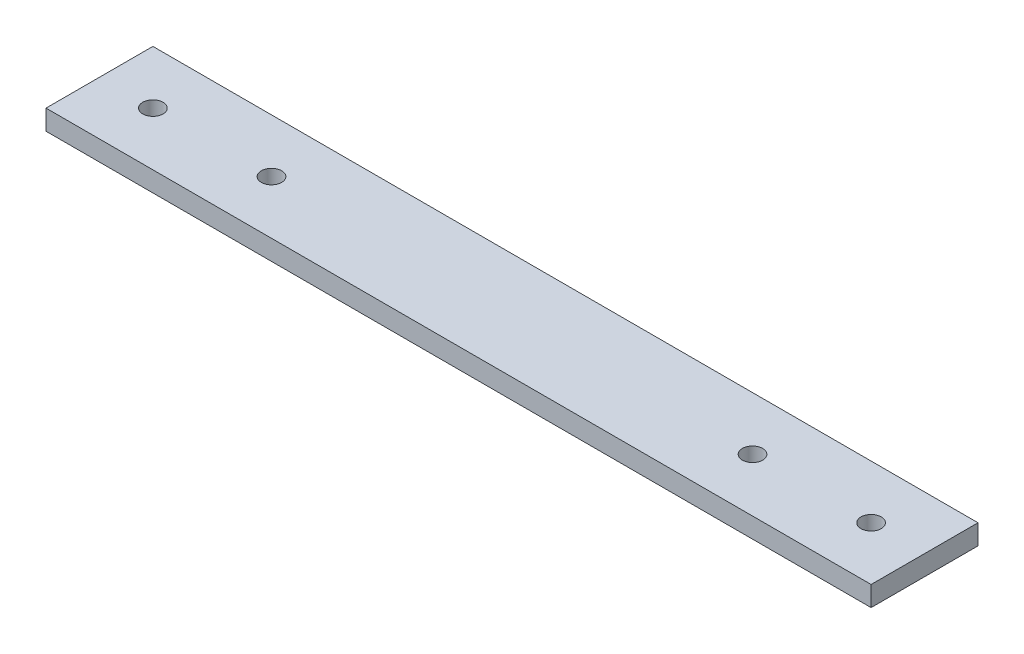
ISO-10303-21;
HEADER;
FILE_DESCRIPTION(('STEP AP214'),'2;1');
FILE_NAME('part.step','',(''),(''),'','','');
FILE_SCHEMA(('AUTOMOTIVE_DESIGN { 1 0 10303 214 1 1 1 1 }'));
ENDSEC;
DATA;
#1=APPLICATION_CONTEXT('core data for automotive mechanical design processes');
#2=APPLICATION_PROTOCOL_DEFINITION('international standard','automotive_design',2000,#1);
#3=PRODUCT_CONTEXT('',#1,'mechanical');
#4=PRODUCT('Part','Part','',(#3));
#5=PRODUCT_RELATED_PRODUCT_CATEGORY('part','',(#4));
#6=PRODUCT_DEFINITION_FORMATION('','',#4);
#7=PRODUCT_DEFINITION_CONTEXT('part definition',#1,'design');
#8=PRODUCT_DEFINITION('design','',#6,#7);
#9=PRODUCT_DEFINITION_SHAPE('','',#8);
#10=(LENGTH_UNIT() NAMED_UNIT(*) SI_UNIT(.MILLI.,.METRE.));
#11=(NAMED_UNIT(*) PLANE_ANGLE_UNIT() SI_UNIT($,.RADIAN.));
#12=(NAMED_UNIT(*) SI_UNIT($,.STERADIAN.) SOLID_ANGLE_UNIT());
#13=UNCERTAINTY_MEASURE_WITH_UNIT(LENGTH_MEASURE(1.E-05),#10,'distance_accuracy_value','');
#14=(GEOMETRIC_REPRESENTATION_CONTEXT(3) GLOBAL_UNCERTAINTY_ASSIGNED_CONTEXT((#13)) GLOBAL_UNIT_ASSIGNED_CONTEXT((#10,
#11,#12)) REPRESENTATION_CONTEXT('',''));
#15=CARTESIAN_POINT('',(0.,0.,0.));
#16=DIRECTION('',(0.,0.,1.));
#17=DIRECTION('',(1.,0.,0.));
#18=AXIS2_PLACEMENT_3D('',#15,#16,#17);
#19=CARTESIAN_POINT('',(-98.0313,4.7625,12.7));
#20=DIRECTION('',(1.,0.,0.));
#21=DIRECTION('',(0.,0.,-1.));
#22=AXIS2_PLACEMENT_3D('',#19,#20,#21);
#23=PLANE('',#22);
#24=DIRECTION('',(0.,0.,1.));
#25=VECTOR('',#24,1.);
#26=CARTESIAN_POINT('',(-98.0313,0.,12.7));
#27=LINE('',#26,#25);
#28=CARTESIAN_POINT('',(-98.0313,0.,-12.7));
#29=VERTEX_POINT('',#28);
#30=CARTESIAN_POINT('',(-98.0313,0.,12.7));
#31=VERTEX_POINT('',#30);
#32=EDGE_CURVE('E97',#29,#31,#27,.T.);
#33=ORIENTED_EDGE('',*,*,#32,.T.);
#34=DIRECTION('',(0.,-1.,0.));
#35=VECTOR('',#34,1.);
#36=CARTESIAN_POINT('',(-98.0313,4.7625,12.7));
#37=LINE('',#36,#35);
#38=CARTESIAN_POINT('',(-98.0313,4.7625,12.7));
#39=VERTEX_POINT('',#38);
#40=EDGE_CURVE('E11',#39,#31,#37,.T.);
#41=ORIENTED_EDGE('',*,*,#40,.F.);
#42=DIRECTION('',(0.,0.,1.));
#43=VECTOR('',#42,1.);
#44=CARTESIAN_POINT('',(-98.0313,4.7625,12.7));
#45=LINE('',#44,#43);
#46=CARTESIAN_POINT('',(-98.0313,4.7625,-12.7));
#47=VERTEX_POINT('',#46);
#48=EDGE_CURVE('E85',#47,#39,#45,.T.);
#49=ORIENTED_EDGE('',*,*,#48,.F.);
#50=DIRECTION('',(0.,-1.,0.));
#51=VECTOR('',#50,1.);
#52=CARTESIAN_POINT('',(-98.0313,4.7625,-12.7));
#53=LINE('',#52,#51);
#54=EDGE_CURVE('E93',#47,#29,#53,.T.);
#55=ORIENTED_EDGE('',*,*,#54,.T.);
#56=EDGE_LOOP('',(#33,#41,#49,#55));
#57=FACE_BOUND('',#56,.T.);
#58=ADVANCED_FACE('F34',(#57),#23,.F.);
#59=CARTESIAN_POINT('',(98.0313,4.7625,12.7));
#60=DIRECTION('',(0.,0.,-1.));
#61=DIRECTION('',(-1.,0.,0.));
#62=AXIS2_PLACEMENT_3D('',#59,#60,#61);
#63=PLANE('',#62);
#64=DIRECTION('',(1.,0.,0.));
#65=VECTOR('',#64,1.);
#66=CARTESIAN_POINT('',(98.0313,0.,12.7));
#67=LINE('',#66,#65);
#68=CARTESIAN_POINT('',(98.0313,0.,12.7));
#69=VERTEX_POINT('',#68);
#70=EDGE_CURVE('E89',#31,#69,#67,.T.);
#71=ORIENTED_EDGE('',*,*,#70,.T.);
#72=DIRECTION('',(0.,-1.,0.));
#73=VECTOR('',#72,1.);
#74=CARTESIAN_POINT('',(98.0313,4.7625,12.7));
#75=LINE('',#74,#73);
#76=CARTESIAN_POINT('',(98.0313,4.7625,12.7));
#77=VERTEX_POINT('',#76);
#78=EDGE_CURVE('E42',#77,#69,#75,.T.);
#79=ORIENTED_EDGE('',*,*,#78,.F.);
#80=DIRECTION('',(1.,0.,0.));
#81=VECTOR('',#80,1.);
#82=CARTESIAN_POINT('',(98.0313,4.7625,12.7));
#83=LINE('',#82,#81);
#84=EDGE_CURVE('E80',#39,#77,#83,.T.);
#85=ORIENTED_EDGE('',*,*,#84,.F.);
#86=ORIENTED_EDGE('',*,*,#40,.T.);
#87=EDGE_LOOP('',(#71,#79,#85,#86));
#88=FACE_BOUND('',#87,.T.);
#89=ADVANCED_FACE('F88',(#88),#63,.F.);
#90=CARTESIAN_POINT('',(98.0313,4.7625,12.7));
#91=DIRECTION('',(-1.,0.,0.));
#92=DIRECTION('',(0.,0.,1.));
#93=AXIS2_PLACEMENT_3D('',#90,#91,#92);
#94=PLANE('',#93);
#95=DIRECTION('',(0.,0.,-1.));
#96=VECTOR('',#95,1.);
#97=CARTESIAN_POINT('',(98.0313,0.,12.7));
#98=LINE('',#97,#96);
#99=CARTESIAN_POINT('',(98.0313,0.,-12.7));
#100=VERTEX_POINT('',#99);
#101=EDGE_CURVE('E67',#69,#100,#98,.T.);
#102=ORIENTED_EDGE('',*,*,#101,.T.);
#103=DIRECTION('',(0.,-1.,0.));
#104=VECTOR('',#103,1.);
#105=CARTESIAN_POINT('',(98.0313,4.7625,-12.7));
#106=LINE('',#105,#104);
#107=CARTESIAN_POINT('',(98.0313,4.7625,-12.7));
#108=VERTEX_POINT('',#107);
#109=EDGE_CURVE('E90',#108,#100,#106,.T.);
#110=ORIENTED_EDGE('',*,*,#109,.F.);
#111=DIRECTION('',(0.,0.,-1.));
#112=VECTOR('',#111,1.);
#113=CARTESIAN_POINT('',(98.0313,4.7625,12.7));
#114=LINE('',#113,#112);
#115=EDGE_CURVE('E83',#77,#108,#114,.T.);
#116=ORIENTED_EDGE('',*,*,#115,.F.);
#117=ORIENTED_EDGE('',*,*,#78,.T.);
#118=EDGE_LOOP('',(#102,#110,#116,#117));
#119=FACE_BOUND('',#118,.T.);
#120=ADVANCED_FACE('F91',(#119),#94,.F.);
#121=CARTESIAN_POINT('',(98.0313,4.7625,-12.7));
#122=DIRECTION('',(0.,0.,1.));
#123=DIRECTION('',(1.,0.,0.));
#124=AXIS2_PLACEMENT_3D('',#121,#122,#123);
#125=PLANE('',#124);
#126=DIRECTION('',(-1.,0.,0.));
#127=VECTOR('',#126,1.);
#128=CARTESIAN_POINT('',(98.0313,0.,-12.7));
#129=LINE('',#128,#127);
#130=EDGE_CURVE('E73',#100,#29,#129,.T.);
#131=ORIENTED_EDGE('',*,*,#130,.T.);
#132=ORIENTED_EDGE('',*,*,#54,.F.);
#133=DIRECTION('',(-1.,0.,0.));
#134=VECTOR('',#133,1.);
#135=CARTESIAN_POINT('',(98.0313,4.7625,-12.7));
#136=LINE('',#135,#134);
#137=EDGE_CURVE('E50',#108,#47,#136,.T.);
#138=ORIENTED_EDGE('',*,*,#137,.F.);
#139=ORIENTED_EDGE('',*,*,#109,.T.);
#140=EDGE_LOOP('',(#131,#132,#138,#139));
#141=FACE_BOUND('',#140,.T.);
#142=ADVANCED_FACE('F105',(#141),#125,.F.);
#143=CARTESIAN_POINT('',(0.,4.7625,0.));
#144=DIRECTION('',(0.,1.,0.));
#145=DIRECTION('',(0.,0.,1.));
#146=AXIS2_PLACEMENT_3D('',#143,#144,#145);
#147=PLANE('',#146);
#148=CARTESIAN_POINT('',(85.3313,4.7625,0.));
#149=DIRECTION('',(0.,1.,0.));
#150=DIRECTION('',(0.,0.,1.));
#151=AXIS2_PLACEMENT_3D('',#148,#149,#150);
#152=CIRCLE('',#151,2.413);
#153=CARTESIAN_POINT('',(85.3313,4.7625,2.41299999999998));
#154=VERTEX_POINT('',#153);
#155=EDGE_CURVE('E117',#154,#154,#152,.T.);
#156=ORIENTED_EDGE('',*,*,#155,.F.);
#157=EDGE_LOOP('',(#156));
#158=FACE_BOUND('',#157,.T.);
#159=CARTESIAN_POINT('',(-85.3313,4.7625,0.));
#160=DIRECTION('',(0.,1.,0.));
#161=DIRECTION('',(0.,0.,1.));
#162=AXIS2_PLACEMENT_3D('',#159,#160,#161);
#163=CIRCLE('',#162,2.413);
#164=CARTESIAN_POINT('',(-85.3313,4.7625,2.413));
#165=VERTEX_POINT('',#164);
#166=EDGE_CURVE('E123',#165,#165,#163,.T.);
#167=ORIENTED_EDGE('',*,*,#166,.F.);
#168=EDGE_LOOP('',(#167));
#169=FACE_BOUND('',#168,.T.);
#170=CARTESIAN_POINT('',(57.15,4.7625,0.));
#171=DIRECTION('',(0.,1.,0.));
#172=DIRECTION('',(0.,0.,1.));
#173=AXIS2_PLACEMENT_3D('',#170,#171,#172);
#174=CIRCLE('',#173,2.413);
#175=CARTESIAN_POINT('',(57.15,4.7625,2.413));
#176=VERTEX_POINT('',#175);
#177=EDGE_CURVE('E129',#176,#176,#174,.T.);
#178=ORIENTED_EDGE('',*,*,#177,.F.);
#179=EDGE_LOOP('',(#178));
#180=FACE_BOUND('',#179,.T.);
#181=CARTESIAN_POINT('',(-57.15,4.7625,0.));
#182=DIRECTION('',(0.,1.,0.));
#183=DIRECTION('',(0.,0.,1.));
#184=AXIS2_PLACEMENT_3D('',#181,#182,#183);
#185=CIRCLE('',#184,2.413);
#186=CARTESIAN_POINT('',(-57.15,4.7625,2.413));
#187=VERTEX_POINT('',#186);
#188=EDGE_CURVE('E111',#187,#187,#185,.T.);
#189=ORIENTED_EDGE('',*,*,#188,.F.);
#190=EDGE_LOOP('',(#189));
#191=FACE_BOUND('',#190,.T.);
#192=ORIENTED_EDGE('',*,*,#48,.T.);
#193=ORIENTED_EDGE('',*,*,#84,.T.);
#194=ORIENTED_EDGE('',*,*,#115,.T.);
#195=ORIENTED_EDGE('',*,*,#137,.T.);
#196=EDGE_LOOP('',(#192,#193,#194,#195));
#197=FACE_BOUND('',#196,.T.);
#198=ADVANCED_FACE('F81',(#158,#169,#180,#191,#197),#147,.T.);
#199=CARTESIAN_POINT('',(0.,0.,0.));
#200=DIRECTION('',(0.,1.,0.));
#201=DIRECTION('',(0.,0.,1.));
#202=AXIS2_PLACEMENT_3D('',#199,#200,#201);
#203=PLANE('',#202);
#204=CARTESIAN_POINT('',(85.3313,0.,0.));
#205=DIRECTION('',(0.,1.,0.));
#206=DIRECTION('',(0.,0.,1.));
#207=AXIS2_PLACEMENT_3D('',#204,#205,#206);
#208=CIRCLE('',#207,2.413);
#209=CARTESIAN_POINT('',(85.3313,0.,2.41299999999998));
#210=VERTEX_POINT('',#209);
#211=EDGE_CURVE('E120',#210,#210,#208,.T.);
#212=ORIENTED_EDGE('',*,*,#211,.T.);
#213=EDGE_LOOP('',(#212));
#214=FACE_BOUND('',#213,.T.);
#215=CARTESIAN_POINT('',(-85.3313,0.,0.));
#216=DIRECTION('',(0.,1.,0.));
#217=DIRECTION('',(0.,0.,1.));
#218=AXIS2_PLACEMENT_3D('',#215,#216,#217);
#219=CIRCLE('',#218,2.413);
#220=CARTESIAN_POINT('',(-85.3313,0.,2.413));
#221=VERTEX_POINT('',#220);
#222=EDGE_CURVE('E126',#221,#221,#219,.T.);
#223=ORIENTED_EDGE('',*,*,#222,.T.);
#224=EDGE_LOOP('',(#223));
#225=FACE_BOUND('',#224,.T.);
#226=CARTESIAN_POINT('',(57.15,0.,0.));
#227=DIRECTION('',(0.,1.,0.));
#228=DIRECTION('',(0.,0.,1.));
#229=AXIS2_PLACEMENT_3D('',#226,#227,#228);
#230=CIRCLE('',#229,2.413);
#231=CARTESIAN_POINT('',(57.15,0.,2.413));
#232=VERTEX_POINT('',#231);
#233=EDGE_CURVE('E114',#232,#232,#230,.T.);
#234=ORIENTED_EDGE('',*,*,#233,.T.);
#235=EDGE_LOOP('',(#234));
#236=FACE_BOUND('',#235,.T.);
#237=CARTESIAN_POINT('',(-57.15,0.,0.));
#238=DIRECTION('',(0.,1.,0.));
#239=DIRECTION('',(0.,0.,1.));
#240=AXIS2_PLACEMENT_3D('',#237,#238,#239);
#241=CIRCLE('',#240,2.413);
#242=CARTESIAN_POINT('',(-57.15,0.,2.413));
#243=VERTEX_POINT('',#242);
#244=EDGE_CURVE('E100',#243,#243,#241,.T.);
#245=ORIENTED_EDGE('',*,*,#244,.T.);
#246=EDGE_LOOP('',(#245));
#247=FACE_BOUND('',#246,.T.);
#248=ORIENTED_EDGE('',*,*,#32,.F.);
#249=ORIENTED_EDGE('',*,*,#130,.F.);
#250=ORIENTED_EDGE('',*,*,#101,.F.);
#251=ORIENTED_EDGE('',*,*,#70,.F.);
#252=EDGE_LOOP('',(#248,#249,#250,#251));
#253=FACE_BOUND('',#252,.T.);
#254=ADVANCED_FACE('F108',(#214,#225,#236,#247,#253),#203,.F.);
#255=CARTESIAN_POINT('',(-57.15,0.,0.));
#256=DIRECTION('',(0.,1.,0.));
#257=DIRECTION('',(0.,0.,1.));
#258=AXIS2_PLACEMENT_3D('',#255,#256,#257);
#259=CYLINDRICAL_SURFACE('',#258,2.413);
#260=CARTESIAN_POINT('',(-57.15,0.,2.413));
#261=CARTESIAN_POINT('',(-57.15,0.049609375,2.413));
#262=CARTESIAN_POINT('',(-57.15,0.09921875,2.413));
#263=CARTESIAN_POINT('',(-57.15,0.1984375,2.413));
#264=CARTESIAN_POINT('',(-57.15,0.248046875,2.413));
#265=CARTESIAN_POINT('',(-57.15,0.347265625,2.413));
#266=CARTESIAN_POINT('',(-57.15,0.396875,2.413));
#267=CARTESIAN_POINT('',(-57.15,0.49609375,2.413));
#268=CARTESIAN_POINT('',(-57.15,0.545703125,2.413));
#269=CARTESIAN_POINT('',(-57.15,0.644921875,2.413));
#270=CARTESIAN_POINT('',(-57.15,0.69453125,2.413));
#271=CARTESIAN_POINT('',(-57.15,0.79375,2.413));
#272=CARTESIAN_POINT('',(-57.15,0.843359375,2.413));
#273=CARTESIAN_POINT('',(-57.15,0.942578125,2.413));
#274=CARTESIAN_POINT('',(-57.15,0.9921875,2.413));
#275=CARTESIAN_POINT('',(-57.15,1.09140625,2.413));
#276=CARTESIAN_POINT('',(-57.15,1.141015625,2.413));
#277=CARTESIAN_POINT('',(-57.15,1.240234375,2.413));
#278=CARTESIAN_POINT('',(-57.15,1.28984375,2.413));
#279=CARTESIAN_POINT('',(-57.15,1.3890625,2.413));
#280=CARTESIAN_POINT('',(-57.15,1.438671875,2.413));
#281=CARTESIAN_POINT('',(-57.15,1.537890625,2.413));
#282=CARTESIAN_POINT('',(-57.15,1.5875,2.413));
#283=CARTESIAN_POINT('',(-57.15,1.68671875,2.413));
#284=CARTESIAN_POINT('',(-57.15,1.736328125,2.413));
#285=CARTESIAN_POINT('',(-57.15,1.835546875,2.413));
#286=CARTESIAN_POINT('',(-57.15,1.88515625,2.413));
#287=CARTESIAN_POINT('',(-57.15,1.984375,2.413));
#288=CARTESIAN_POINT('',(-57.15,2.033984375,2.413));
#289=CARTESIAN_POINT('',(-57.15,2.133203125,2.413));
#290=CARTESIAN_POINT('',(-57.15,2.1828125,2.413));
#291=CARTESIAN_POINT('',(-57.15,2.28203125,2.413));
#292=CARTESIAN_POINT('',(-57.15,2.331640625,2.413));
#293=CARTESIAN_POINT('',(-57.15,2.430859375,2.413));
#294=CARTESIAN_POINT('',(-57.15,2.48046875,2.413));
#295=CARTESIAN_POINT('',(-57.15,2.5796875,2.413));
#296=CARTESIAN_POINT('',(-57.15,2.629296875,2.413));
#297=CARTESIAN_POINT('',(-57.15,2.728515625,2.413));
#298=CARTESIAN_POINT('',(-57.15,2.778125,2.413));
#299=CARTESIAN_POINT('',(-57.15,2.87734375,2.413));
#300=CARTESIAN_POINT('',(-57.15,2.926953125,2.413));
#301=CARTESIAN_POINT('',(-57.15,3.026171875,2.413));
#302=CARTESIAN_POINT('',(-57.15,3.07578125,2.413));
#303=CARTESIAN_POINT('',(-57.15,3.175,2.413));
#304=CARTESIAN_POINT('',(-57.15,3.224609375,2.413));
#305=CARTESIAN_POINT('',(-57.15,3.323828125,2.413));
#306=CARTESIAN_POINT('',(-57.15,3.3734375,2.413));
#307=CARTESIAN_POINT('',(-57.15,3.47265625,2.413));
#308=CARTESIAN_POINT('',(-57.15,3.522265625,2.413));
#309=CARTESIAN_POINT('',(-57.15,3.621484375,2.413));
#310=CARTESIAN_POINT('',(-57.15,3.67109375,2.413));
#311=CARTESIAN_POINT('',(-57.15,3.7703125,2.413));
#312=CARTESIAN_POINT('',(-57.15,3.819921875,2.413));
#313=CARTESIAN_POINT('',(-57.15,3.919140625,2.413));
#314=CARTESIAN_POINT('',(-57.15,3.96875,2.413));
#315=CARTESIAN_POINT('',(-57.15,4.06796875,2.413));
#316=CARTESIAN_POINT('',(-57.15,4.117578125,2.413));
#317=CARTESIAN_POINT('',(-57.15,4.216796875,2.413));
#318=CARTESIAN_POINT('',(-57.15,4.26640625,2.413));
#319=CARTESIAN_POINT('',(-57.15,4.365625,2.413));
#320=CARTESIAN_POINT('',(-57.15,4.415234375,2.413));
#321=CARTESIAN_POINT('',(-57.15,4.514453125,2.413));
#322=CARTESIAN_POINT('',(-57.15,4.5640625,2.413));
#323=CARTESIAN_POINT('',(-57.15,4.66328125,2.413));
#324=CARTESIAN_POINT('',(-57.15,4.712890625,2.413));
#325=CARTESIAN_POINT('',(-57.15,4.7625,2.413));
#326=B_SPLINE_CURVE_WITH_KNOTS('',3,(#260,#261,#262,#263,#264,#265,#266,#267,#268,#269,#270,
#271,#272,#273,#274,#275,#276,#277,#278,#279,#280,#281,#282,#283,#284,#285,#286,#287,#288,#289,
#290,#291,#292,#293,#294,#295,#296,#297,#298,#299,#300,#301,#302,#303,#304,#305,#306,#307,#308,
#309,#310,#311,#312,#313,#314,#315,#316,#317,#318,#319,#320,#321,#322,#323,#324,#325),
.UNSPECIFIED.,.F.,.F.,(4,2,2,2,2,2,2,2,2,2,2,2,2,2,2,2,2,2,2,2,2,2,2,2,2,2,2,2,2,2,2,2,4),(0.,
0.148828125,0.29765625,0.446484375,0.5953125,0.744140625,0.89296875,1.041796875,1.190625,
1.339453125,1.48828125,1.637109375,1.7859375,1.934765625,2.08359375,2.232421875,2.38125,
2.530078125,2.67890625,2.827734375,2.9765625,3.125390625,3.27421875,3.423046875,3.571875,
3.720703125,3.86953125,4.018359375,4.1671875,4.316015625,4.46484375,4.613671875,4.7625),.UNSPECIFIED.);
#327=EDGE_CURVE('BSEAM141',#243,#187,#326,.T.);
#328=ORIENTED_EDGE('',*,*,#244,.F.);
#329=ORIENTED_EDGE('',*,*,#188,.T.);
#330=ORIENTED_EDGE('',*,*,#327,.T.);
#331=ORIENTED_EDGE('',*,*,#327,.F.);
#332=EDGE_LOOP('',(#328,#330,#329,#331));
#333=FACE_BOUND('',#332,.T.);
#334=ADVANCED_FACE('F141',(#333),#259,.F.);
#335=CARTESIAN_POINT('',(57.15,0.,0.));
#336=DIRECTION('',(0.,1.,0.));
#337=DIRECTION('',(0.,0.,1.));
#338=AXIS2_PLACEMENT_3D('',#335,#336,#337);
#339=CYLINDRICAL_SURFACE('',#338,2.413);
#340=CARTESIAN_POINT('',(57.15,0.,2.413));
#341=CARTESIAN_POINT('',(57.15,0.049609375,2.413));
#342=CARTESIAN_POINT('',(57.15,0.09921875,2.413));
#343=CARTESIAN_POINT('',(57.15,0.1984375,2.413));
#344=CARTESIAN_POINT('',(57.15,0.248046875,2.413));
#345=CARTESIAN_POINT('',(57.15,0.347265625,2.413));
#346=CARTESIAN_POINT('',(57.15,0.396875,2.413));
#347=CARTESIAN_POINT('',(57.15,0.49609375,2.413));
#348=CARTESIAN_POINT('',(57.15,0.545703125,2.413));
#349=CARTESIAN_POINT('',(57.15,0.644921875,2.413));
#350=CARTESIAN_POINT('',(57.15,0.69453125,2.413));
#351=CARTESIAN_POINT('',(57.15,0.79375,2.413));
#352=CARTESIAN_POINT('',(57.15,0.843359375,2.413));
#353=CARTESIAN_POINT('',(57.15,0.942578125,2.413));
#354=CARTESIAN_POINT('',(57.15,0.9921875,2.413));
#355=CARTESIAN_POINT('',(57.15,1.09140625,2.413));
#356=CARTESIAN_POINT('',(57.15,1.141015625,2.413));
#357=CARTESIAN_POINT('',(57.15,1.240234375,2.413));
#358=CARTESIAN_POINT('',(57.15,1.28984375,2.413));
#359=CARTESIAN_POINT('',(57.15,1.3890625,2.413));
#360=CARTESIAN_POINT('',(57.15,1.438671875,2.413));
#361=CARTESIAN_POINT('',(57.15,1.537890625,2.413));
#362=CARTESIAN_POINT('',(57.15,1.5875,2.413));
#363=CARTESIAN_POINT('',(57.15,1.68671875,2.413));
#364=CARTESIAN_POINT('',(57.15,1.736328125,2.413));
#365=CARTESIAN_POINT('',(57.15,1.835546875,2.413));
#366=CARTESIAN_POINT('',(57.15,1.88515625,2.413));
#367=CARTESIAN_POINT('',(57.15,1.984375,2.413));
#368=CARTESIAN_POINT('',(57.15,2.033984375,2.413));
#369=CARTESIAN_POINT('',(57.15,2.133203125,2.413));
#370=CARTESIAN_POINT('',(57.15,2.1828125,2.413));
#371=CARTESIAN_POINT('',(57.15,2.28203125,2.413));
#372=CARTESIAN_POINT('',(57.15,2.331640625,2.413));
#373=CARTESIAN_POINT('',(57.15,2.430859375,2.413));
#374=CARTESIAN_POINT('',(57.15,2.48046875,2.413));
#375=CARTESIAN_POINT('',(57.15,2.5796875,2.413));
#376=CARTESIAN_POINT('',(57.15,2.629296875,2.413));
#377=CARTESIAN_POINT('',(57.15,2.728515625,2.413));
#378=CARTESIAN_POINT('',(57.15,2.778125,2.413));
#379=CARTESIAN_POINT('',(57.15,2.87734375,2.413));
#380=CARTESIAN_POINT('',(57.15,2.926953125,2.413));
#381=CARTESIAN_POINT('',(57.15,3.026171875,2.413));
#382=CARTESIAN_POINT('',(57.15,3.07578125,2.413));
#383=CARTESIAN_POINT('',(57.15,3.175,2.413));
#384=CARTESIAN_POINT('',(57.15,3.224609375,2.413));
#385=CARTESIAN_POINT('',(57.15,3.323828125,2.413));
#386=CARTESIAN_POINT('',(57.15,3.3734375,2.413));
#387=CARTESIAN_POINT('',(57.15,3.47265625,2.413));
#388=CARTESIAN_POINT('',(57.15,3.522265625,2.413));
#389=CARTESIAN_POINT('',(57.15,3.621484375,2.413));
#390=CARTESIAN_POINT('',(57.15,3.67109375,2.413));
#391=CARTESIAN_POINT('',(57.15,3.7703125,2.413));
#392=CARTESIAN_POINT('',(57.15,3.819921875,2.413));
#393=CARTESIAN_POINT('',(57.15,3.919140625,2.413));
#394=CARTESIAN_POINT('',(57.15,3.96875,2.413));
#395=CARTESIAN_POINT('',(57.15,4.06796875,2.413));
#396=CARTESIAN_POINT('',(57.15,4.117578125,2.413));
#397=CARTESIAN_POINT('',(57.15,4.216796875,2.413));
#398=CARTESIAN_POINT('',(57.15,4.26640625,2.413));
#399=CARTESIAN_POINT('',(57.15,4.365625,2.413));
#400=CARTESIAN_POINT('',(57.15,4.415234375,2.413));
#401=CARTESIAN_POINT('',(57.15,4.514453125,2.413));
#402=CARTESIAN_POINT('',(57.15,4.5640625,2.413));
#403=CARTESIAN_POINT('',(57.15,4.66328125,2.413));
#404=CARTESIAN_POINT('',(57.15,4.712890625,2.413));
#405=CARTESIAN_POINT('',(57.15,4.7625,2.413));
#406=B_SPLINE_CURVE_WITH_KNOTS('',3,(#340,#341,#342,#343,#344,#345,#346,#347,#348,#349,#350,
#351,#352,#353,#354,#355,#356,#357,#358,#359,#360,#361,#362,#363,#364,#365,#366,#367,#368,#369,
#370,#371,#372,#373,#374,#375,#376,#377,#378,#379,#380,#381,#382,#383,#384,#385,#386,#387,#388,
#389,#390,#391,#392,#393,#394,#395,#396,#397,#398,#399,#400,#401,#402,#403,#404,#405),
.UNSPECIFIED.,.F.,.F.,(4,2,2,2,2,2,2,2,2,2,2,2,2,2,2,2,2,2,2,2,2,2,2,2,2,2,2,2,2,2,2,2,4),(0.,
0.148828125,0.29765625,0.446484375,0.5953125,0.744140625,0.89296875,1.041796875,1.190625,
1.339453125,1.48828125,1.637109375,1.7859375,1.934765625,2.08359375,2.232421875,2.38125,
2.530078125,2.67890625,2.827734375,2.9765625,3.125390625,3.27421875,3.423046875,3.571875,
3.720703125,3.86953125,4.018359375,4.1671875,4.316015625,4.46484375,4.613671875,4.7625),.UNSPECIFIED.);
#407=EDGE_CURVE('BSEAM137',#232,#176,#406,.T.);
#408=ORIENTED_EDGE('',*,*,#233,.F.);
#409=ORIENTED_EDGE('',*,*,#177,.T.);
#410=ORIENTED_EDGE('',*,*,#407,.T.);
#411=ORIENTED_EDGE('',*,*,#407,.F.);
#412=EDGE_LOOP('',(#408,#410,#409,#411));
#413=FACE_BOUND('',#412,.T.);
#414=ADVANCED_FACE('F137',(#413),#339,.F.);
#415=CARTESIAN_POINT('',(-85.3313,0.,0.));
#416=DIRECTION('',(0.,1.,0.));
#417=DIRECTION('',(0.,0.,1.));
#418=AXIS2_PLACEMENT_3D('',#415,#416,#417);
#419=CYLINDRICAL_SURFACE('',#418,2.413);
#420=CARTESIAN_POINT('',(-85.3313,0.,2.413));
#421=CARTESIAN_POINT('',(-85.3313,0.049609375,2.413));
#422=CARTESIAN_POINT('',(-85.3313,0.09921875,2.413));
#423=CARTESIAN_POINT('',(-85.3313,0.1984375,2.413));
#424=CARTESIAN_POINT('',(-85.3313,0.248046875,2.413));
#425=CARTESIAN_POINT('',(-85.3313,0.347265625,2.413));
#426=CARTESIAN_POINT('',(-85.3313,0.396875,2.413));
#427=CARTESIAN_POINT('',(-85.3313,0.49609375,2.413));
#428=CARTESIAN_POINT('',(-85.3313,0.545703125,2.413));
#429=CARTESIAN_POINT('',(-85.3313,0.644921875,2.413));
#430=CARTESIAN_POINT('',(-85.3313,0.69453125,2.413));
#431=CARTESIAN_POINT('',(-85.3313,0.79375,2.413));
#432=CARTESIAN_POINT('',(-85.3313,0.843359375,2.413));
#433=CARTESIAN_POINT('',(-85.3313,0.942578125,2.413));
#434=CARTESIAN_POINT('',(-85.3313,0.9921875,2.413));
#435=CARTESIAN_POINT('',(-85.3313,1.09140625,2.413));
#436=CARTESIAN_POINT('',(-85.3313,1.141015625,2.413));
#437=CARTESIAN_POINT('',(-85.3313,1.240234375,2.413));
#438=CARTESIAN_POINT('',(-85.3313,1.28984375,2.413));
#439=CARTESIAN_POINT('',(-85.3313,1.3890625,2.413));
#440=CARTESIAN_POINT('',(-85.3313,1.438671875,2.413));
#441=CARTESIAN_POINT('',(-85.3313,1.537890625,2.413));
#442=CARTESIAN_POINT('',(-85.3313,1.5875,2.413));
#443=CARTESIAN_POINT('',(-85.3313,1.68671875,2.413));
#444=CARTESIAN_POINT('',(-85.3313,1.736328125,2.413));
#445=CARTESIAN_POINT('',(-85.3313,1.835546875,2.413));
#446=CARTESIAN_POINT('',(-85.3313,1.88515625,2.413));
#447=CARTESIAN_POINT('',(-85.3313,1.984375,2.413));
#448=CARTESIAN_POINT('',(-85.3313,2.033984375,2.413));
#449=CARTESIAN_POINT('',(-85.3313,2.133203125,2.413));
#450=CARTESIAN_POINT('',(-85.3313,2.1828125,2.413));
#451=CARTESIAN_POINT('',(-85.3313,2.28203125,2.413));
#452=CARTESIAN_POINT('',(-85.3313,2.331640625,2.413));
#453=CARTESIAN_POINT('',(-85.3313,2.430859375,2.413));
#454=CARTESIAN_POINT('',(-85.3313,2.48046875,2.413));
#455=CARTESIAN_POINT('',(-85.3313,2.5796875,2.413));
#456=CARTESIAN_POINT('',(-85.3313,2.629296875,2.413));
#457=CARTESIAN_POINT('',(-85.3313,2.728515625,2.413));
#458=CARTESIAN_POINT('',(-85.3313,2.778125,2.413));
#459=CARTESIAN_POINT('',(-85.3313,2.87734375,2.413));
#460=CARTESIAN_POINT('',(-85.3313,2.926953125,2.413));
#461=CARTESIAN_POINT('',(-85.3313,3.026171875,2.413));
#462=CARTESIAN_POINT('',(-85.3313,3.07578125,2.413));
#463=CARTESIAN_POINT('',(-85.3313,3.175,2.413));
#464=CARTESIAN_POINT('',(-85.3313,3.224609375,2.413));
#465=CARTESIAN_POINT('',(-85.3313,3.323828125,2.413));
#466=CARTESIAN_POINT('',(-85.3313,3.3734375,2.413));
#467=CARTESIAN_POINT('',(-85.3313,3.47265625,2.413));
#468=CARTESIAN_POINT('',(-85.3313,3.522265625,2.413));
#469=CARTESIAN_POINT('',(-85.3313,3.621484375,2.413));
#470=CARTESIAN_POINT('',(-85.3313,3.67109375,2.413));
#471=CARTESIAN_POINT('',(-85.3313,3.7703125,2.413));
#472=CARTESIAN_POINT('',(-85.3313,3.819921875,2.413));
#473=CARTESIAN_POINT('',(-85.3313,3.919140625,2.413));
#474=CARTESIAN_POINT('',(-85.3313,3.96875,2.413));
#475=CARTESIAN_POINT('',(-85.3313,4.06796875,2.413));
#476=CARTESIAN_POINT('',(-85.3313,4.117578125,2.413));
#477=CARTESIAN_POINT('',(-85.3313,4.216796875,2.413));
#478=CARTESIAN_POINT('',(-85.3313,4.26640625,2.413));
#479=CARTESIAN_POINT('',(-85.3313,4.365625,2.413));
#480=CARTESIAN_POINT('',(-85.3313,4.415234375,2.413));
#481=CARTESIAN_POINT('',(-85.3313,4.514453125,2.413));
#482=CARTESIAN_POINT('',(-85.3313,4.5640625,2.413));
#483=CARTESIAN_POINT('',(-85.3313,4.66328125,2.413));
#484=CARTESIAN_POINT('',(-85.3313,4.712890625,2.413));
#485=CARTESIAN_POINT('',(-85.3313,4.7625,2.413));
#486=B_SPLINE_CURVE_WITH_KNOTS('',3,(#420,#421,#422,#423,#424,#425,#426,#427,#428,#429,#430,
#431,#432,#433,#434,#435,#436,#437,#438,#439,#440,#441,#442,#443,#444,#445,#446,#447,#448,#449,
#450,#451,#452,#453,#454,#455,#456,#457,#458,#459,#460,#461,#462,#463,#464,#465,#466,#467,#468,
#469,#470,#471,#472,#473,#474,#475,#476,#477,#478,#479,#480,#481,#482,#483,#484,#485),
.UNSPECIFIED.,.F.,.F.,(4,2,2,2,2,2,2,2,2,2,2,2,2,2,2,2,2,2,2,2,2,2,2,2,2,2,2,2,2,2,2,2,4),(0.,
0.148828125,0.29765625,0.446484375,0.5953125,0.744140625,0.89296875,1.041796875,1.190625,
1.339453125,1.48828125,1.637109375,1.7859375,1.934765625,2.08359375,2.232421875,2.38125,
2.530078125,2.67890625,2.827734375,2.9765625,3.125390625,3.27421875,3.423046875,3.571875,
3.720703125,3.86953125,4.018359375,4.1671875,4.316015625,4.46484375,4.613671875,4.7625),.UNSPECIFIED.);
#487=EDGE_CURVE('BSEAM140',#221,#165,#486,.T.);
#488=ORIENTED_EDGE('',*,*,#222,.F.);
#489=ORIENTED_EDGE('',*,*,#166,.T.);
#490=ORIENTED_EDGE('',*,*,#487,.T.);
#491=ORIENTED_EDGE('',*,*,#487,.F.);
#492=EDGE_LOOP('',(#488,#490,#489,#491));
#493=FACE_BOUND('',#492,.T.);
#494=ADVANCED_FACE('F140',(#493),#419,.F.);
#495=CARTESIAN_POINT('',(85.3313,0.,0.));
#496=DIRECTION('',(0.,1.,0.));
#497=DIRECTION('',(0.,0.,1.));
#498=AXIS2_PLACEMENT_3D('',#495,#496,#497);
#499=CYLINDRICAL_SURFACE('',#498,2.413);
#500=CARTESIAN_POINT('',(85.3313,0.,2.41299999999998));
#501=CARTESIAN_POINT('',(85.3313,0.049609375,2.41299999999998));
#502=CARTESIAN_POINT('',(85.3313,0.09921875,2.41299999999998));
#503=CARTESIAN_POINT('',(85.3313,0.1984375,2.41299999999998));
#504=CARTESIAN_POINT('',(85.3313,0.248046875,2.41299999999998));
#505=CARTESIAN_POINT('',(85.3313,0.347265625,2.41299999999998));
#506=CARTESIAN_POINT('',(85.3313,0.396875,2.41299999999998));
#507=CARTESIAN_POINT('',(85.3313,0.49609375,2.41299999999998));
#508=CARTESIAN_POINT('',(85.3313,0.545703125,2.41299999999998));
#509=CARTESIAN_POINT('',(85.3313,0.644921875,2.41299999999998));
#510=CARTESIAN_POINT('',(85.3313,0.69453125,2.41299999999998));
#511=CARTESIAN_POINT('',(85.3313,0.79375,2.41299999999998));
#512=CARTESIAN_POINT('',(85.3313,0.843359375,2.41299999999998));
#513=CARTESIAN_POINT('',(85.3313,0.942578125,2.41299999999998));
#514=CARTESIAN_POINT('',(85.3313,0.9921875,2.41299999999998));
#515=CARTESIAN_POINT('',(85.3313,1.09140625,2.41299999999998));
#516=CARTESIAN_POINT('',(85.3313,1.141015625,2.41299999999998));
#517=CARTESIAN_POINT('',(85.3313,1.240234375,2.41299999999998));
#518=CARTESIAN_POINT('',(85.3313,1.28984375,2.41299999999998));
#519=CARTESIAN_POINT('',(85.3313,1.3890625,2.41299999999998));
#520=CARTESIAN_POINT('',(85.3313,1.438671875,2.41299999999998));
#521=CARTESIAN_POINT('',(85.3313,1.537890625,2.41299999999998));
#522=CARTESIAN_POINT('',(85.3313,1.5875,2.41299999999998));
#523=CARTESIAN_POINT('',(85.3313,1.68671875,2.41299999999998));
#524=CARTESIAN_POINT('',(85.3313,1.736328125,2.41299999999998));
#525=CARTESIAN_POINT('',(85.3313,1.835546875,2.41299999999998));
#526=CARTESIAN_POINT('',(85.3313,1.88515625,2.41299999999998));
#527=CARTESIAN_POINT('',(85.3313,1.984375,2.41299999999998));
#528=CARTESIAN_POINT('',(85.3313,2.033984375,2.41299999999998));
#529=CARTESIAN_POINT('',(85.3313,2.133203125,2.41299999999998));
#530=CARTESIAN_POINT('',(85.3313,2.1828125,2.41299999999998));
#531=CARTESIAN_POINT('',(85.3313,2.28203125,2.41299999999998));
#532=CARTESIAN_POINT('',(85.3313,2.331640625,2.41299999999998));
#533=CARTESIAN_POINT('',(85.3313,2.430859375,2.41299999999998));
#534=CARTESIAN_POINT('',(85.3313,2.48046875,2.41299999999998));
#535=CARTESIAN_POINT('',(85.3313,2.5796875,2.41299999999998));
#536=CARTESIAN_POINT('',(85.3313,2.629296875,2.41299999999998));
#537=CARTESIAN_POINT('',(85.3313,2.728515625,2.41299999999998));
#538=CARTESIAN_POINT('',(85.3313,2.778125,2.41299999999998));
#539=CARTESIAN_POINT('',(85.3313,2.87734375,2.41299999999998));
#540=CARTESIAN_POINT('',(85.3313,2.926953125,2.41299999999998));
#541=CARTESIAN_POINT('',(85.3313,3.026171875,2.41299999999998));
#542=CARTESIAN_POINT('',(85.3313,3.07578125,2.41299999999998));
#543=CARTESIAN_POINT('',(85.3313,3.175,2.41299999999998));
#544=CARTESIAN_POINT('',(85.3313,3.224609375,2.41299999999998));
#545=CARTESIAN_POINT('',(85.3313,3.323828125,2.41299999999998));
#546=CARTESIAN_POINT('',(85.3313,3.3734375,2.41299999999998));
#547=CARTESIAN_POINT('',(85.3313,3.47265625,2.41299999999998));
#548=CARTESIAN_POINT('',(85.3313,3.522265625,2.41299999999998));
#549=CARTESIAN_POINT('',(85.3313,3.621484375,2.41299999999998));
#550=CARTESIAN_POINT('',(85.3313,3.67109375,2.41299999999998));
#551=CARTESIAN_POINT('',(85.3313,3.7703125,2.41299999999998));
#552=CARTESIAN_POINT('',(85.3313,3.819921875,2.41299999999998));
#553=CARTESIAN_POINT('',(85.3313,3.919140625,2.41299999999998));
#554=CARTESIAN_POINT('',(85.3313,3.96875,2.41299999999998));
#555=CARTESIAN_POINT('',(85.3313,4.06796875,2.41299999999998));
#556=CARTESIAN_POINT('',(85.3313,4.117578125,2.41299999999998));
#557=CARTESIAN_POINT('',(85.3313,4.216796875,2.41299999999998));
#558=CARTESIAN_POINT('',(85.3313,4.26640625,2.41299999999998));
#559=CARTESIAN_POINT('',(85.3313,4.365625,2.41299999999998));
#560=CARTESIAN_POINT('',(85.3313,4.415234375,2.41299999999998));
#561=CARTESIAN_POINT('',(85.3313,4.514453125,2.41299999999998));
#562=CARTESIAN_POINT('',(85.3313,4.5640625,2.41299999999998));
#563=CARTESIAN_POINT('',(85.3313,4.66328125,2.41299999999998));
#564=CARTESIAN_POINT('',(85.3313,4.712890625,2.41299999999998));
#565=CARTESIAN_POINT('',(85.3313,4.7625,2.41299999999998));
#566=B_SPLINE_CURVE_WITH_KNOTS('',3,(#500,#501,#502,#503,#504,#505,#506,#507,#508,#509,#510,
#511,#512,#513,#514,#515,#516,#517,#518,#519,#520,#521,#522,#523,#524,#525,#526,#527,#528,#529,
#530,#531,#532,#533,#534,#535,#536,#537,#538,#539,#540,#541,#542,#543,#544,#545,#546,#547,#548,
#549,#550,#551,#552,#553,#554,#555,#556,#557,#558,#559,#560,#561,#562,#563,#564,#565),
.UNSPECIFIED.,.F.,.F.,(4,2,2,2,2,2,2,2,2,2,2,2,2,2,2,2,2,2,2,2,2,2,2,2,2,2,2,2,2,2,2,2,4),(0.,
0.148828125,0.29765625,0.446484375,0.5953125,0.744140625,0.89296875,1.041796875,1.190625,
1.339453125,1.48828125,1.637109375,1.7859375,1.934765625,2.08359375,2.232421875,2.38125,
2.530078125,2.67890625,2.827734375,2.9765625,3.125390625,3.27421875,3.423046875,3.571875,
3.720703125,3.86953125,4.018359375,4.1671875,4.316015625,4.46484375,4.613671875,4.7625),.UNSPECIFIED.);
#567=EDGE_CURVE('BSEAM202',#210,#154,#566,.T.);
#568=ORIENTED_EDGE('',*,*,#211,.F.);
#569=ORIENTED_EDGE('',*,*,#155,.T.);
#570=ORIENTED_EDGE('',*,*,#567,.T.);
#571=ORIENTED_EDGE('',*,*,#567,.F.);
#572=EDGE_LOOP('',(#568,#570,#569,#571));
#573=FACE_BOUND('',#572,.T.);
#574=ADVANCED_FACE('F202',(#573),#499,.F.);
#575=CLOSED_SHELL('',(#58,#89,#120,#142,#198,#254,#334,#414,#494,#574));
#576=MANIFOLD_SOLID_BREP('B2',#575);
#577=ADVANCED_BREP_SHAPE_REPRESENTATION('',(#18,#576),#14);
#578=SHAPE_DEFINITION_REPRESENTATION(#9,#577);
ENDSEC;
END-ISO-10303-21;
